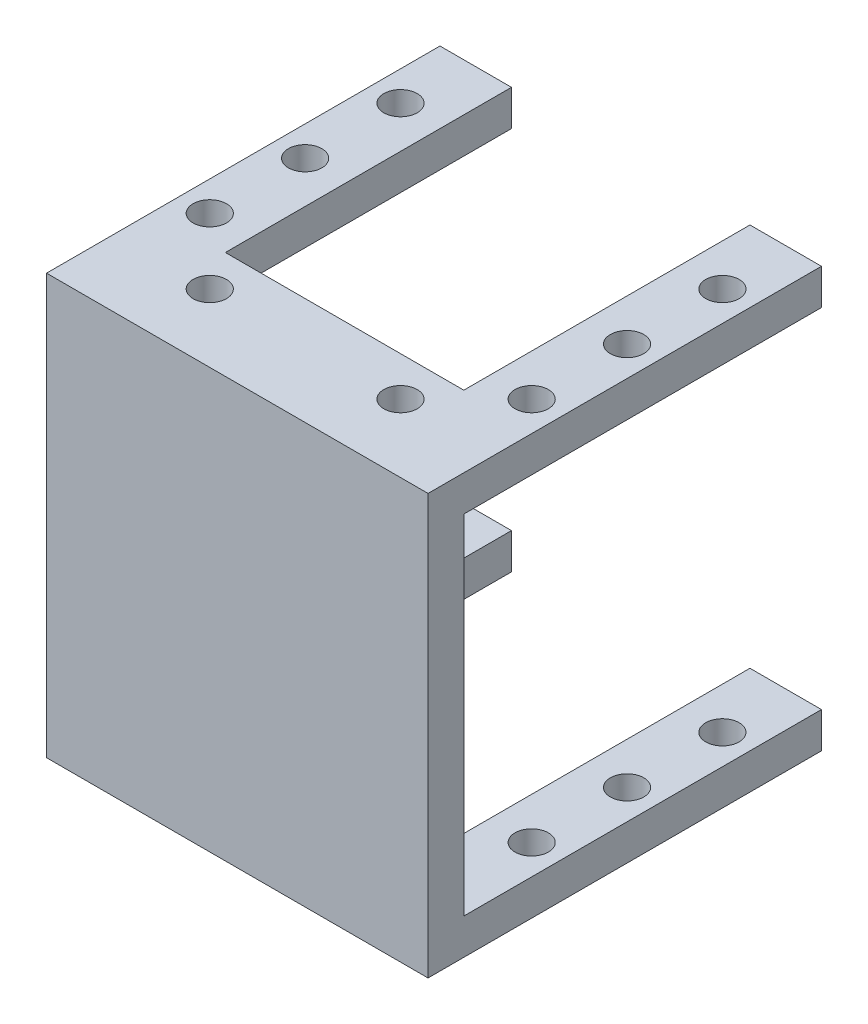
ISO-10303-21;
HEADER;
FILE_DESCRIPTION(('STEP AP214'),'2;1');
FILE_NAME('part.step','',(''),(''),'','','');
FILE_SCHEMA(('AUTOMOTIVE_DESIGN { 1 0 10303 214 1 1 1 1 }'));
ENDSEC;
DATA;
#1=APPLICATION_CONTEXT('core data for automotive mechanical design processes');
#2=APPLICATION_PROTOCOL_DEFINITION('international standard','automotive_design',2000,#1);
#3=PRODUCT_CONTEXT('',#1,'mechanical');
#4=PRODUCT('Part','Part','',(#3));
#5=PRODUCT_RELATED_PRODUCT_CATEGORY('part','',(#4));
#6=PRODUCT_DEFINITION_FORMATION('','',#4);
#7=PRODUCT_DEFINITION_CONTEXT('part definition',#1,'design');
#8=PRODUCT_DEFINITION('design','',#6,#7);
#9=PRODUCT_DEFINITION_SHAPE('','',#8);
#10=(LENGTH_UNIT() NAMED_UNIT(*) SI_UNIT(.MILLI.,.METRE.));
#11=(NAMED_UNIT(*) PLANE_ANGLE_UNIT() SI_UNIT($,.RADIAN.));
#12=(NAMED_UNIT(*) SI_UNIT($,.STERADIAN.) SOLID_ANGLE_UNIT());
#13=UNCERTAINTY_MEASURE_WITH_UNIT(LENGTH_MEASURE(1.E-05),#10,'distance_accuracy_value','');
#14=(GEOMETRIC_REPRESENTATION_CONTEXT(3) GLOBAL_UNCERTAINTY_ASSIGNED_CONTEXT((#13)) GLOBAL_UNIT_ASSIGNED_CONTEXT((#10,
#11,#12)) REPRESENTATION_CONTEXT('',''));
#15=CARTESIAN_POINT('',(0.,0.,0.));
#16=DIRECTION('',(0.,0.,1.));
#17=DIRECTION('',(1.,0.,0.));
#18=AXIS2_PLACEMENT_3D('',#15,#16,#17);
#19=CARTESIAN_POINT('',(0.,0.,6.));
#20=DIRECTION('',(0.,0.,1.));
#21=DIRECTION('',(1.,0.,0.));
#22=AXIS2_PLACEMENT_3D('',#19,#20,#21);
#23=PLANE('',#22);
#24=DIRECTION('',(1.,0.,0.));
#25=VECTOR('',#24,1.);
#26=CARTESIAN_POINT('',(-16.,32.2,6.));
#27=LINE('',#26,#25);
#28=CARTESIAN_POINT('',(-16.,32.2,6.));
#29=VERTEX_POINT('',#28);
#30=CARTESIAN_POINT('',(16.,32.2,5.99999999999999));
#31=VERTEX_POINT('',#30);
#32=EDGE_CURVE('E48',#29,#31,#27,.T.);
#33=ORIENTED_EDGE('',*,*,#32,.T.);
#34=DIRECTION('',(0.,1.,0.));
#35=VECTOR('',#34,1.);
#36=CARTESIAN_POINT('',(16.,35.2,6.));
#37=LINE('',#36,#35);
#38=CARTESIAN_POINT('',(16.,3.,5.99999999999999));
#39=VERTEX_POINT('',#38);
#40=EDGE_CURVE('E186',#39,#31,#37,.T.);
#41=ORIENTED_EDGE('',*,*,#40,.F.);
#42=DIRECTION('',(1.,0.,0.));
#43=VECTOR('',#42,1.);
#44=CARTESIAN_POINT('',(-16.,3.,6.));
#45=LINE('',#44,#43);
#46=CARTESIAN_POINT('',(-16.,3.,6.));
#47=VERTEX_POINT('',#46);
#48=EDGE_CURVE('E172',#47,#39,#45,.T.);
#49=ORIENTED_EDGE('',*,*,#48,.F.);
#50=DIRECTION('',(0.,-1.,0.));
#51=VECTOR('',#50,1.);
#52=CARTESIAN_POINT('',(-16.,35.2,6.));
#53=LINE('',#52,#51);
#54=EDGE_CURVE('E195',#29,#47,#53,.T.);
#55=ORIENTED_EDGE('',*,*,#54,.F.);
#56=EDGE_LOOP('',(#33,#41,#49,#55));
#57=FACE_BOUND('',#56,.T.);
#58=ADVANCED_FACE('F33',(#57),#23,.F.);
#59=CARTESIAN_POINT('',(0.,3.,0.));
#60=DIRECTION('',(0.,1.,0.));
#61=DIRECTION('',(0.,0.,1.));
#62=AXIS2_PLACEMENT_3D('',#59,#60,#61);
#63=PLANE('',#62);
#64=CARTESIAN_POINT('',(13.4999999999998,3.,-10.1923076923077));
#65=DIRECTION('',(0.,1.,0.));
#66=DIRECTION('',(0.,0.,-1.));
#67=AXIS2_PLACEMENT_3D('',#64,#65,#66);
#68=CIRCLE('',#67,1.4);
#69=CARTESIAN_POINT('',(13.4999999999998,3.,-11.5923076923077));
#70=VERTEX_POINT('',#69);
#71=EDGE_CURVE('E218',#70,#70,#68,.T.);
#72=ORIENTED_EDGE('',*,*,#71,.F.);
#73=EDGE_LOOP('',(#72));
#74=FACE_BOUND('',#73,.T.);
#75=CARTESIAN_POINT('',(-13.4999999999998,3.,-2.19230769230768));
#76=DIRECTION('',(0.,1.,0.));
#77=DIRECTION('',(0.,0.,1.));
#78=AXIS2_PLACEMENT_3D('',#75,#76,#77);
#79=CIRCLE('',#78,1.4);
#80=CARTESIAN_POINT('',(-13.4999999999998,3.,-0.792307692307682));
#81=VERTEX_POINT('',#80);
#82=EDGE_CURVE('E230',#81,#81,#79,.T.);
#83=ORIENTED_EDGE('',*,*,#82,.F.);
#84=EDGE_LOOP('',(#83));
#85=FACE_BOUND('',#84,.T.);
#86=CARTESIAN_POINT('',(-13.4999999999999,3.,-18.1923076923077));
#87=DIRECTION('',(0.,1.,0.));
#88=DIRECTION('',(0.,0.,1.));
#89=AXIS2_PLACEMENT_3D('',#86,#87,#88);
#90=CIRCLE('',#89,1.4);
#91=CARTESIAN_POINT('',(-13.4999999999999,3.,-16.7923076923077));
#92=VERTEX_POINT('',#91);
#93=EDGE_CURVE('E242',#92,#92,#90,.T.);
#94=ORIENTED_EDGE('',*,*,#93,.F.);
#95=EDGE_LOOP('',(#94));
#96=FACE_BOUND('',#95,.T.);
#97=CARTESIAN_POINT('',(-8.,3.,3.30769230769232));
#98=DIRECTION('',(0.,1.,0.));
#99=DIRECTION('',(0.,0.,1.));
#100=AXIS2_PLACEMENT_3D('',#97,#98,#99);
#101=CIRCLE('',#100,1.4);
#102=CARTESIAN_POINT('',(-8.,3.,4.70769230769232));
#103=VERTEX_POINT('',#102);
#104=EDGE_CURVE('E138',#103,#103,#101,.T.);
#105=ORIENTED_EDGE('',*,*,#104,.F.);
#106=EDGE_LOOP('',(#105));
#107=FACE_BOUND('',#106,.T.);
#108=DIRECTION('',(-1.,0.,0.));
#109=VECTOR('',#108,1.);
#110=CARTESIAN_POINT('',(-10.,3.,-24.));
#111=LINE('',#110,#109);
#112=CARTESIAN_POINT('',(-10.,3.,-24.));
#113=VERTEX_POINT('',#112);
#114=CARTESIAN_POINT('',(-16.,3.,-24.));
#115=VERTEX_POINT('',#114);
#116=EDGE_CURVE('E149',#113,#115,#111,.T.);
#117=ORIENTED_EDGE('',*,*,#116,.T.);
#118=DIRECTION('',(0.,0.,1.));
#119=VECTOR('',#118,1.);
#120=CARTESIAN_POINT('',(-16.,3.,-24.));
#121=LINE('',#120,#119);
#122=EDGE_CURVE('E92',#115,#47,#121,.T.);
#123=ORIENTED_EDGE('',*,*,#122,.T.);
#124=ORIENTED_EDGE('',*,*,#48,.T.);
#125=DIRECTION('',(0.,0.,-1.));
#126=VECTOR('',#125,1.);
#127=CARTESIAN_POINT('',(16.,3.,5.99999999999999));
#128=LINE('',#127,#126);
#129=CARTESIAN_POINT('',(16.,3.,-24.));
#130=VERTEX_POINT('',#129);
#131=EDGE_CURVE('E180',#39,#130,#128,.T.);
#132=ORIENTED_EDGE('',*,*,#131,.T.);
#133=DIRECTION('',(-1.,0.,0.));
#134=VECTOR('',#133,1.);
#135=CARTESIAN_POINT('',(16.,3.,-24.));
#136=LINE('',#135,#134);
#137=CARTESIAN_POINT('',(9.99999999999999,3.,-24.));
#138=VERTEX_POINT('',#137);
#139=EDGE_CURVE('E113',#130,#138,#136,.T.);
#140=ORIENTED_EDGE('',*,*,#139,.T.);
#141=DIRECTION('',(0.,0.,1.));
#142=VECTOR('',#141,1.);
#143=CARTESIAN_POINT('',(9.99999999999999,3.,-24.));
#144=LINE('',#143,#142);
#145=CARTESIAN_POINT('',(10.,3.,0.));
#146=VERTEX_POINT('',#145);
#147=EDGE_CURVE('E105',#138,#146,#144,.T.);
#148=ORIENTED_EDGE('',*,*,#147,.T.);
#149=DIRECTION('',(-1.,0.,0.));
#150=VECTOR('',#149,1.);
#151=CARTESIAN_POINT('',(10.,3.,0.));
#152=LINE('',#151,#150);
#153=CARTESIAN_POINT('',(-10.,3.,0.));
#154=VERTEX_POINT('',#153);
#155=EDGE_CURVE('E110',#146,#154,#152,.T.);
#156=ORIENTED_EDGE('',*,*,#155,.T.);
#157=DIRECTION('',(0.,0.,-1.));
#158=VECTOR('',#157,1.);
#159=CARTESIAN_POINT('',(-10.,3.,0.));
#160=LINE('',#159,#158);
#161=EDGE_CURVE('E57',#154,#113,#160,.T.);
#162=ORIENTED_EDGE('',*,*,#161,.T.);
#163=EDGE_LOOP('',(#117,#123,#124,#132,#140,#148,#156,#162));
#164=FACE_BOUND('',#163,.T.);
#165=CARTESIAN_POINT('',(8.,3.,3.30769230769232));
#166=DIRECTION('',(0.,1.,0.));
#167=DIRECTION('',(0.,0.,-1.));
#168=AXIS2_PLACEMENT_3D('',#165,#166,#167);
#169=CIRCLE('',#168,1.4);
#170=CARTESIAN_POINT('',(8.,3.,1.90769230769232));
#171=VERTEX_POINT('',#170);
#172=EDGE_CURVE('E248',#171,#171,#169,.T.);
#173=ORIENTED_EDGE('',*,*,#172,.F.);
#174=EDGE_LOOP('',(#173));
#175=FACE_BOUND('',#174,.T.);
#176=CARTESIAN_POINT('',(-13.4999999999998,3.,-10.1923076923077));
#177=DIRECTION('',(0.,1.,0.));
#178=DIRECTION('',(0.,0.,1.));
#179=AXIS2_PLACEMENT_3D('',#176,#177,#178);
#180=CIRCLE('',#179,1.4);
#181=CARTESIAN_POINT('',(-13.4999999999998,3.,-8.79230769230768));
#182=VERTEX_POINT('',#181);
#183=EDGE_CURVE('E236',#182,#182,#180,.T.);
#184=ORIENTED_EDGE('',*,*,#183,.F.);
#185=EDGE_LOOP('',(#184));
#186=FACE_BOUND('',#185,.T.);
#187=CARTESIAN_POINT('',(13.4999999999998,3.,-2.19230769230768));
#188=DIRECTION('',(0.,1.,0.));
#189=DIRECTION('',(0.,0.,-1.));
#190=AXIS2_PLACEMENT_3D('',#187,#188,#189);
#191=CIRCLE('',#190,1.4);
#192=CARTESIAN_POINT('',(13.4999999999998,3.,-3.59230769230768));
#193=VERTEX_POINT('',#192);
#194=EDGE_CURVE('E224',#193,#193,#191,.T.);
#195=ORIENTED_EDGE('',*,*,#194,.F.);
#196=EDGE_LOOP('',(#195));
#197=FACE_BOUND('',#196,.T.);
#198=CARTESIAN_POINT('',(13.4999999999999,3.,-18.1923076923077));
#199=DIRECTION('',(0.,1.,0.));
#200=DIRECTION('',(0.,0.,-1.));
#201=AXIS2_PLACEMENT_3D('',#198,#199,#200);
#202=CIRCLE('',#201,1.4);
#203=CARTESIAN_POINT('',(13.4999999999999,3.,-19.5923076923077));
#204=VERTEX_POINT('',#203);
#205=EDGE_CURVE('E212',#204,#204,#202,.T.);
#206=ORIENTED_EDGE('',*,*,#205,.F.);
#207=EDGE_LOOP('',(#206));
#208=FACE_BOUND('',#207,.T.);
#209=ADVANCED_FACE('F107',(#74,#85,#96,#107,#164,#175,#186,#197,#208),#63,.T.);
#210=CARTESIAN_POINT('',(0.,0.,0.));
#211=DIRECTION('',(0.,1.,0.));
#212=DIRECTION('',(0.,0.,1.));
#213=AXIS2_PLACEMENT_3D('',#210,#211,#212);
#214=PLANE('',#213);
#215=DIRECTION('',(-1.,0.,0.));
#216=VECTOR('',#215,1.);
#217=CARTESIAN_POINT('',(-10.,0.,-24.));
#218=LINE('',#217,#216);
#219=CARTESIAN_POINT('',(-10.,0.,-24.));
#220=VERTEX_POINT('',#219);
#221=CARTESIAN_POINT('',(-16.,0.,-24.));
#222=VERTEX_POINT('',#221);
#223=EDGE_CURVE('E134',#220,#222,#218,.T.);
#224=ORIENTED_EDGE('',*,*,#223,.F.);
#225=DIRECTION('',(0.,0.,-1.));
#226=VECTOR('',#225,1.);
#227=CARTESIAN_POINT('',(-10.,0.,0.));
#228=LINE('',#227,#226);
#229=CARTESIAN_POINT('',(-10.,0.,0.));
#230=VERTEX_POINT('',#229);
#231=EDGE_CURVE('E84',#230,#220,#228,.T.);
#232=ORIENTED_EDGE('',*,*,#231,.F.);
#233=DIRECTION('',(-1.,0.,0.));
#234=VECTOR('',#233,1.);
#235=CARTESIAN_POINT('',(10.,0.,0.));
#236=LINE('',#235,#234);
#237=CARTESIAN_POINT('',(10.,0.,0.));
#238=VERTEX_POINT('',#237);
#239=EDGE_CURVE('E146',#238,#230,#236,.T.);
#240=ORIENTED_EDGE('',*,*,#239,.F.);
#241=DIRECTION('',(0.,0.,1.));
#242=VECTOR('',#241,1.);
#243=CARTESIAN_POINT('',(9.99999999999999,0.,-24.));
#244=LINE('',#243,#242);
#245=CARTESIAN_POINT('',(9.99999999999999,0.,-24.));
#246=VERTEX_POINT('',#245);
#247=EDGE_CURVE('E122',#246,#238,#244,.T.);
#248=ORIENTED_EDGE('',*,*,#247,.F.);
#249=DIRECTION('',(-1.,0.,0.));
#250=VECTOR('',#249,1.);
#251=CARTESIAN_POINT('',(16.,0.,-24.));
#252=LINE('',#251,#250);
#253=CARTESIAN_POINT('',(16.,0.,-24.));
#254=VERTEX_POINT('',#253);
#255=EDGE_CURVE('E143',#254,#246,#252,.T.);
#256=ORIENTED_EDGE('',*,*,#255,.F.);
#257=DIRECTION('',(0.,0.,-1.));
#258=VECTOR('',#257,1.);
#259=CARTESIAN_POINT('',(16.,0.,5.99999999999999));
#260=LINE('',#259,#258);
#261=CARTESIAN_POINT('',(16.,0.,9.));
#262=VERTEX_POINT('',#261);
#263=EDGE_CURVE('E141',#262,#254,#260,.T.);
#264=ORIENTED_EDGE('',*,*,#263,.F.);
#265=DIRECTION('',(1.,0.,0.));
#266=VECTOR('',#265,1.);
#267=CARTESIAN_POINT('',(-16.,0.,9.));
#268=LINE('',#267,#266);
#269=CARTESIAN_POINT('',(-16.,0.,9.));
#270=VERTEX_POINT('',#269);
#271=EDGE_CURVE('E198',#270,#262,#268,.T.);
#272=ORIENTED_EDGE('',*,*,#271,.F.);
#273=DIRECTION('',(0.,0.,1.));
#274=VECTOR('',#273,1.);
#275=CARTESIAN_POINT('',(-16.,0.,-24.));
#276=LINE('',#275,#274);
#277=EDGE_CURVE('E137',#222,#270,#276,.T.);
#278=ORIENTED_EDGE('',*,*,#277,.F.);
#279=EDGE_LOOP('',(#224,#232,#240,#248,#256,#264,#272,#278));
#280=FACE_BOUND('',#279,.T.);
#281=CARTESIAN_POINT('',(-8.,0.,3.30769230769232));
#282=DIRECTION('',(0.,1.,0.));
#283=DIRECTION('',(0.,0.,1.));
#284=AXIS2_PLACEMENT_3D('',#281,#282,#283);
#285=CIRCLE('',#284,1.4);
#286=CARTESIAN_POINT('',(-8.,0.,4.70769230769232));
#287=VERTEX_POINT('',#286);
#288=EDGE_CURVE('E175',#287,#287,#285,.T.);
#289=ORIENTED_EDGE('',*,*,#288,.T.);
#290=EDGE_LOOP('',(#289));
#291=FACE_BOUND('',#290,.T.);
#292=CARTESIAN_POINT('',(8.,0.,3.30769230769232));
#293=DIRECTION('',(0.,1.,0.));
#294=DIRECTION('',(0.,0.,-1.));
#295=AXIS2_PLACEMENT_3D('',#292,#293,#294);
#296=CIRCLE('',#295,1.4);
#297=CARTESIAN_POINT('',(8.,0.,1.90769230769232));
#298=VERTEX_POINT('',#297);
#299=EDGE_CURVE('E245',#298,#298,#296,.T.);
#300=ORIENTED_EDGE('',*,*,#299,.T.);
#301=EDGE_LOOP('',(#300));
#302=FACE_BOUND('',#301,.T.);
#303=CARTESIAN_POINT('',(-13.4999999999999,0.,-18.1923076923077));
#304=DIRECTION('',(0.,1.,0.));
#305=DIRECTION('',(0.,0.,1.));
#306=AXIS2_PLACEMENT_3D('',#303,#304,#305);
#307=CIRCLE('',#306,1.4);
#308=CARTESIAN_POINT('',(-13.4999999999999,0.,-16.7923076923077));
#309=VERTEX_POINT('',#308);
#310=EDGE_CURVE('E239',#309,#309,#307,.T.);
#311=ORIENTED_EDGE('',*,*,#310,.T.);
#312=EDGE_LOOP('',(#311));
#313=FACE_BOUND('',#312,.T.);
#314=CARTESIAN_POINT('',(-13.4999999999998,0.,-10.1923076923077));
#315=DIRECTION('',(0.,1.,0.));
#316=DIRECTION('',(0.,0.,1.));
#317=AXIS2_PLACEMENT_3D('',#314,#315,#316);
#318=CIRCLE('',#317,1.4);
#319=CARTESIAN_POINT('',(-13.4999999999998,0.,-8.79230769230768));
#320=VERTEX_POINT('',#319);
#321=EDGE_CURVE('E233',#320,#320,#318,.T.);
#322=ORIENTED_EDGE('',*,*,#321,.T.);
#323=EDGE_LOOP('',(#322));
#324=FACE_BOUND('',#323,.T.);
#325=CARTESIAN_POINT('',(-13.4999999999998,0.,-2.19230769230768));
#326=DIRECTION('',(0.,1.,0.));
#327=DIRECTION('',(0.,0.,1.));
#328=AXIS2_PLACEMENT_3D('',#325,#326,#327);
#329=CIRCLE('',#328,1.4);
#330=CARTESIAN_POINT('',(-13.4999999999998,0.,-0.792307692307682));
#331=VERTEX_POINT('',#330);
#332=EDGE_CURVE('E227',#331,#331,#329,.T.);
#333=ORIENTED_EDGE('',*,*,#332,.T.);
#334=EDGE_LOOP('',(#333));
#335=FACE_BOUND('',#334,.T.);
#336=CARTESIAN_POINT('',(13.4999999999998,0.,-2.19230769230768));
#337=DIRECTION('',(0.,1.,0.));
#338=DIRECTION('',(0.,0.,-1.));
#339=AXIS2_PLACEMENT_3D('',#336,#337,#338);
#340=CIRCLE('',#339,1.4);
#341=CARTESIAN_POINT('',(13.4999999999998,0.,-3.59230769230768));
#342=VERTEX_POINT('',#341);
#343=EDGE_CURVE('E221',#342,#342,#340,.T.);
#344=ORIENTED_EDGE('',*,*,#343,.T.);
#345=EDGE_LOOP('',(#344));
#346=FACE_BOUND('',#345,.T.);
#347=CARTESIAN_POINT('',(13.4999999999998,0.,-10.1923076923077));
#348=DIRECTION('',(0.,1.,0.));
#349=DIRECTION('',(0.,0.,-1.));
#350=AXIS2_PLACEMENT_3D('',#347,#348,#349);
#351=CIRCLE('',#350,1.4);
#352=CARTESIAN_POINT('',(13.4999999999998,0.,-11.5923076923077));
#353=VERTEX_POINT('',#352);
#354=EDGE_CURVE('E215',#353,#353,#351,.T.);
#355=ORIENTED_EDGE('',*,*,#354,.T.);
#356=EDGE_LOOP('',(#355));
#357=FACE_BOUND('',#356,.T.);
#358=CARTESIAN_POINT('',(13.4999999999999,0.,-18.1923076923077));
#359=DIRECTION('',(0.,1.,0.));
#360=DIRECTION('',(0.,0.,-1.));
#361=AXIS2_PLACEMENT_3D('',#358,#359,#360);
#362=CIRCLE('',#361,1.4);
#363=CARTESIAN_POINT('',(13.4999999999999,0.,-19.5923076923077));
#364=VERTEX_POINT('',#363);
#365=EDGE_CURVE('E211',#364,#364,#362,.T.);
#366=ORIENTED_EDGE('',*,*,#365,.T.);
#367=EDGE_LOOP('',(#366));
#368=FACE_BOUND('',#367,.T.);
#369=ADVANCED_FACE('F162',(#280,#291,#302,#313,#324,#335,#346,#357,#368),#214,.F.);
#370=CARTESIAN_POINT('',(-10.,3.,-24.));
#371=DIRECTION('',(0.,0.,1.));
#372=DIRECTION('',(1.,0.,0.));
#373=AXIS2_PLACEMENT_3D('',#370,#371,#372);
#374=PLANE('',#373);
#375=ORIENTED_EDGE('',*,*,#223,.T.);
#376=DIRECTION('',(0.,-1.,0.));
#377=VECTOR('',#376,1.);
#378=CARTESIAN_POINT('',(-16.,3.,-24.));
#379=LINE('',#378,#377);
#380=EDGE_CURVE('E11',#115,#222,#379,.T.);
#381=ORIENTED_EDGE('',*,*,#380,.F.);
#382=ORIENTED_EDGE('',*,*,#116,.F.);
#383=DIRECTION('',(0.,-1.,0.));
#384=VECTOR('',#383,1.);
#385=CARTESIAN_POINT('',(-10.,3.,-24.));
#386=LINE('',#385,#384);
#387=EDGE_CURVE('E130',#113,#220,#386,.T.);
#388=ORIENTED_EDGE('',*,*,#387,.T.);
#389=EDGE_LOOP('',(#375,#381,#382,#388));
#390=FACE_BOUND('',#389,.T.);
#391=ADVANCED_FACE('F35',(#390),#374,.F.);
#392=CARTESIAN_POINT('',(-16.,3.,-24.));
#393=DIRECTION('',(1.,0.,0.));
#394=DIRECTION('',(0.,0.,-1.));
#395=AXIS2_PLACEMENT_3D('',#392,#393,#394);
#396=PLANE('',#395);
#397=ORIENTED_EDGE('',*,*,#277,.T.);
#398=DIRECTION('',(0.,-1.,0.));
#399=VECTOR('',#398,1.);
#400=CARTESIAN_POINT('',(-16.,35.2,9.));
#401=LINE('',#400,#399);
#402=CARTESIAN_POINT('',(-16.,35.2,9.));
#403=VERTEX_POINT('',#402);
#404=EDGE_CURVE('E194',#403,#270,#401,.T.);
#405=ORIENTED_EDGE('',*,*,#404,.F.);
#406=DIRECTION('',(0.,0.,-1.));
#407=VECTOR('',#406,1.);
#408=CARTESIAN_POINT('',(-16.,35.2,9.));
#409=LINE('',#408,#407);
#410=CARTESIAN_POINT('',(-16.,35.2,-24.));
#411=VERTEX_POINT('',#410);
#412=EDGE_CURVE('E204',#403,#411,#409,.T.);
#413=ORIENTED_EDGE('',*,*,#412,.T.);
#414=DIRECTION('',(0.,-1.,0.));
#415=VECTOR('',#414,1.);
#416=CARTESIAN_POINT('',(-16.,35.2,-24.));
#417=LINE('',#416,#415);
#418=CARTESIAN_POINT('',(-16.,32.2,-24.));
#419=VERTEX_POINT('',#418);
#420=EDGE_CURVE('E368',#411,#419,#417,.T.);
#421=ORIENTED_EDGE('',*,*,#420,.T.);
#422=DIRECTION('',(0.,0.,1.));
#423=VECTOR('',#422,1.);
#424=CARTESIAN_POINT('',(-16.,32.2,-24.));
#425=LINE('',#424,#423);
#426=EDGE_CURVE('E400',#419,#29,#425,.T.);
#427=ORIENTED_EDGE('',*,*,#426,.T.);
#428=ORIENTED_EDGE('',*,*,#54,.T.);
#429=ORIENTED_EDGE('',*,*,#122,.F.);
#430=ORIENTED_EDGE('',*,*,#380,.T.);
#431=EDGE_LOOP('',(#397,#405,#413,#421,#427,#428,#429,#430));
#432=FACE_BOUND('',#431,.T.);
#433=ADVANCED_FACE('F334',(#432),#396,.F.);
#434=CARTESIAN_POINT('',(16.,3.,5.99999999999999));
#435=DIRECTION('',(-1.,0.,0.));
#436=DIRECTION('',(0.,0.,1.));
#437=AXIS2_PLACEMENT_3D('',#434,#435,#436);
#438=PLANE('',#437);
#439=ORIENTED_EDGE('',*,*,#263,.T.);
#440=DIRECTION('',(0.,-1.,0.));
#441=VECTOR('',#440,1.);
#442=CARTESIAN_POINT('',(16.,3.,-24.));
#443=LINE('',#442,#441);
#444=EDGE_CURVE('E41',#130,#254,#443,.T.);
#445=ORIENTED_EDGE('',*,*,#444,.F.);
#446=ORIENTED_EDGE('',*,*,#131,.F.);
#447=ORIENTED_EDGE('',*,*,#40,.T.);
#448=DIRECTION('',(0.,0.,-1.));
#449=VECTOR('',#448,1.);
#450=CARTESIAN_POINT('',(16.,32.2,5.99999999999999));
#451=LINE('',#450,#449);
#452=CARTESIAN_POINT('',(16.,32.2,-24.));
#453=VERTEX_POINT('',#452);
#454=EDGE_CURVE('E189',#31,#453,#451,.T.);
#455=ORIENTED_EDGE('',*,*,#454,.T.);
#456=DIRECTION('',(0.,-1.,0.));
#457=VECTOR('',#456,1.);
#458=CARTESIAN_POINT('',(16.,35.2,-24.));
#459=LINE('',#458,#457);
#460=CARTESIAN_POINT('',(16.,35.2,-24.));
#461=VERTEX_POINT('',#460);
#462=EDGE_CURVE('E200',#461,#453,#459,.T.);
#463=ORIENTED_EDGE('',*,*,#462,.F.);
#464=DIRECTION('',(0.,0.,-1.));
#465=VECTOR('',#464,1.);
#466=CARTESIAN_POINT('',(16.,35.2,9.));
#467=LINE('',#466,#465);
#468=CARTESIAN_POINT('',(16.,35.2,9.));
#469=VERTEX_POINT('',#468);
#470=EDGE_CURVE('E207',#469,#461,#467,.T.);
#471=ORIENTED_EDGE('',*,*,#470,.F.);
#472=DIRECTION('',(0.,1.,0.));
#473=VECTOR('',#472,1.);
#474=CARTESIAN_POINT('',(16.,35.2,9.));
#475=LINE('',#474,#473);
#476=EDGE_CURVE('E354',#262,#469,#475,.T.);
#477=ORIENTED_EDGE('',*,*,#476,.F.);
#478=EDGE_LOOP('',(#439,#445,#446,#447,#455,#463,#471,#477));
#479=FACE_BOUND('',#478,.T.);
#480=ADVANCED_FACE('F183',(#479),#438,.F.);
#481=CARTESIAN_POINT('',(16.,3.,-24.));
#482=DIRECTION('',(0.,0.,1.));
#483=DIRECTION('',(1.,0.,0.));
#484=AXIS2_PLACEMENT_3D('',#481,#482,#483);
#485=PLANE('',#484);
#486=ORIENTED_EDGE('',*,*,#255,.T.);
#487=DIRECTION('',(0.,-1.,0.));
#488=VECTOR('',#487,1.);
#489=CARTESIAN_POINT('',(9.99999999999999,3.,-24.));
#490=LINE('',#489,#488);
#491=EDGE_CURVE('E125',#138,#246,#490,.T.);
#492=ORIENTED_EDGE('',*,*,#491,.F.);
#493=ORIENTED_EDGE('',*,*,#139,.F.);
#494=ORIENTED_EDGE('',*,*,#444,.T.);
#495=EDGE_LOOP('',(#486,#492,#493,#494));
#496=FACE_BOUND('',#495,.T.);
#497=ADVANCED_FACE('F156',(#496),#485,.F.);
#498=CARTESIAN_POINT('',(9.99999999999999,3.,-24.));
#499=DIRECTION('',(1.,0.,0.));
#500=DIRECTION('',(0.,0.,-1.));
#501=AXIS2_PLACEMENT_3D('',#498,#499,#500);
#502=PLANE('',#501);
#503=ORIENTED_EDGE('',*,*,#247,.T.);
#504=DIRECTION('',(0.,-1.,0.));
#505=VECTOR('',#504,1.);
#506=CARTESIAN_POINT('',(10.,3.,0.));
#507=LINE('',#506,#505);
#508=EDGE_CURVE('E119',#146,#238,#507,.T.);
#509=ORIENTED_EDGE('',*,*,#508,.F.);
#510=ORIENTED_EDGE('',*,*,#147,.F.);
#511=ORIENTED_EDGE('',*,*,#491,.T.);
#512=EDGE_LOOP('',(#503,#509,#510,#511));
#513=FACE_BOUND('',#512,.T.);
#514=ADVANCED_FACE('F120',(#513),#502,.F.);
#515=CARTESIAN_POINT('',(10.,3.,0.));
#516=DIRECTION('',(0.,0.,1.));
#517=DIRECTION('',(1.,0.,0.));
#518=AXIS2_PLACEMENT_3D('',#515,#516,#517);
#519=PLANE('',#518);
#520=ORIENTED_EDGE('',*,*,#239,.T.);
#521=DIRECTION('',(0.,-1.,0.));
#522=VECTOR('',#521,1.);
#523=CARTESIAN_POINT('',(-10.,3.,0.));
#524=LINE('',#523,#522);
#525=EDGE_CURVE('E126',#154,#230,#524,.T.);
#526=ORIENTED_EDGE('',*,*,#525,.F.);
#527=ORIENTED_EDGE('',*,*,#155,.F.);
#528=ORIENTED_EDGE('',*,*,#508,.T.);
#529=EDGE_LOOP('',(#520,#526,#527,#528));
#530=FACE_BOUND('',#529,.T.);
#531=ADVANCED_FACE('F128',(#530),#519,.F.);
#532=CARTESIAN_POINT('',(-10.,3.,0.));
#533=DIRECTION('',(-1.,0.,0.));
#534=DIRECTION('',(0.,0.,1.));
#535=AXIS2_PLACEMENT_3D('',#532,#533,#534);
#536=PLANE('',#535);
#537=ORIENTED_EDGE('',*,*,#231,.T.);
#538=ORIENTED_EDGE('',*,*,#387,.F.);
#539=ORIENTED_EDGE('',*,*,#161,.F.);
#540=ORIENTED_EDGE('',*,*,#525,.T.);
#541=EDGE_LOOP('',(#537,#538,#539,#540));
#542=FACE_BOUND('',#541,.T.);
#543=ADVANCED_FACE('F167',(#542),#536,.F.);
#544=CARTESIAN_POINT('',(-8.,3.,3.30769230769232));
#545=DIRECTION('',(0.,-1.,0.));
#546=DIRECTION('',(0.,0.,-1.));
#547=AXIS2_PLACEMENT_3D('',#544,#545,#546);
#548=CYLINDRICAL_SURFACE('',#547,1.4);
#549=ORIENTED_EDGE('',*,*,#104,.T.);
#550=EDGE_LOOP('',(#549));
#551=FACE_BOUND('',#550,.T.);
#552=ORIENTED_EDGE('',*,*,#288,.F.);
#553=EDGE_LOOP('',(#552));
#554=FACE_BOUND('',#553,.T.);
#555=ADVANCED_FACE('F259',(#551,#554),#548,.F.);
#556=CARTESIAN_POINT('',(8.,3.,3.30769230769232));
#557=DIRECTION('',(0.,-1.,0.));
#558=DIRECTION('',(0.,0.,-1.));
#559=AXIS2_PLACEMENT_3D('',#556,#557,#558);
#560=CYLINDRICAL_SURFACE('',#559,1.4);
#561=ORIENTED_EDGE('',*,*,#172,.T.);
#562=EDGE_LOOP('',(#561));
#563=FACE_BOUND('',#562,.T.);
#564=ORIENTED_EDGE('',*,*,#299,.F.);
#565=EDGE_LOOP('',(#564));
#566=FACE_BOUND('',#565,.T.);
#567=ADVANCED_FACE('F261',(#563,#566),#560,.F.);
#568=CARTESIAN_POINT('',(-13.4999999999999,3.,-18.1923076923077));
#569=DIRECTION('',(0.,-1.,0.));
#570=DIRECTION('',(0.,0.,-1.));
#571=AXIS2_PLACEMENT_3D('',#568,#569,#570);
#572=CYLINDRICAL_SURFACE('',#571,1.4);
#573=ORIENTED_EDGE('',*,*,#93,.T.);
#574=EDGE_LOOP('',(#573));
#575=FACE_BOUND('',#574,.T.);
#576=ORIENTED_EDGE('',*,*,#310,.F.);
#577=EDGE_LOOP('',(#576));
#578=FACE_BOUND('',#577,.T.);
#579=ADVANCED_FACE('F267',(#575,#578),#572,.F.);
#580=CARTESIAN_POINT('',(-13.4999999999998,3.,-10.1923076923077));
#581=DIRECTION('',(0.,-1.,0.));
#582=DIRECTION('',(0.,0.,-1.));
#583=AXIS2_PLACEMENT_3D('',#580,#581,#582);
#584=CYLINDRICAL_SURFACE('',#583,1.4);
#585=ORIENTED_EDGE('',*,*,#183,.T.);
#586=EDGE_LOOP('',(#585));
#587=FACE_BOUND('',#586,.T.);
#588=ORIENTED_EDGE('',*,*,#321,.F.);
#589=EDGE_LOOP('',(#588));
#590=FACE_BOUND('',#589,.T.);
#591=ADVANCED_FACE('F301',(#587,#590),#584,.F.);
#592=CARTESIAN_POINT('',(-13.4999999999998,3.,-2.19230769230768));
#593=DIRECTION('',(0.,-1.,0.));
#594=DIRECTION('',(0.,0.,-1.));
#595=AXIS2_PLACEMENT_3D('',#592,#593,#594);
#596=CYLINDRICAL_SURFACE('',#595,1.4);
#597=ORIENTED_EDGE('',*,*,#82,.T.);
#598=EDGE_LOOP('',(#597));
#599=FACE_BOUND('',#598,.T.);
#600=ORIENTED_EDGE('',*,*,#332,.F.);
#601=EDGE_LOOP('',(#600));
#602=FACE_BOUND('',#601,.T.);
#603=ADVANCED_FACE('F297',(#599,#602),#596,.F.);
#604=CARTESIAN_POINT('',(13.4999999999998,3.,-2.19230769230768));
#605=DIRECTION('',(0.,-1.,0.));
#606=DIRECTION('',(0.,0.,-1.));
#607=AXIS2_PLACEMENT_3D('',#604,#605,#606);
#608=CYLINDRICAL_SURFACE('',#607,1.4);
#609=ORIENTED_EDGE('',*,*,#194,.T.);
#610=EDGE_LOOP('',(#609));
#611=FACE_BOUND('',#610,.T.);
#612=ORIENTED_EDGE('',*,*,#343,.F.);
#613=EDGE_LOOP('',(#612));
#614=FACE_BOUND('',#613,.T.);
#615=ADVANCED_FACE('F293',(#611,#614),#608,.F.);
#616=CARTESIAN_POINT('',(13.4999999999998,3.,-10.1923076923077));
#617=DIRECTION('',(0.,-1.,0.));
#618=DIRECTION('',(0.,0.,-1.));
#619=AXIS2_PLACEMENT_3D('',#616,#617,#618);
#620=CYLINDRICAL_SURFACE('',#619,1.4);
#621=ORIENTED_EDGE('',*,*,#71,.T.);
#622=EDGE_LOOP('',(#621));
#623=FACE_BOUND('',#622,.T.);
#624=ORIENTED_EDGE('',*,*,#354,.F.);
#625=EDGE_LOOP('',(#624));
#626=FACE_BOUND('',#625,.T.);
#627=ADVANCED_FACE('F289',(#623,#626),#620,.F.);
#628=CARTESIAN_POINT('',(13.4999999999999,3.,-18.1923076923077));
#629=DIRECTION('',(0.,-1.,0.));
#630=DIRECTION('',(0.,0.,-1.));
#631=AXIS2_PLACEMENT_3D('',#628,#629,#630);
#632=CYLINDRICAL_SURFACE('',#631,1.4);
#633=ORIENTED_EDGE('',*,*,#205,.T.);
#634=EDGE_LOOP('',(#633));
#635=FACE_BOUND('',#634,.T.);
#636=ORIENTED_EDGE('',*,*,#365,.F.);
#637=EDGE_LOOP('',(#636));
#638=FACE_BOUND('',#637,.T.);
#639=ADVANCED_FACE('F285',(#635,#638),#632,.F.);
#640=CARTESIAN_POINT('',(-16.,35.2,9.));
#641=DIRECTION('',(0.,-1.,0.));
#642=DIRECTION('',(0.,0.,-1.));
#643=AXIS2_PLACEMENT_3D('',#640,#641,#642);
#644=PLANE('',#643);
#645=ORIENTED_EDGE('',*,*,#470,.T.);
#646=DIRECTION('',(-1.,0.,0.));
#647=VECTOR('',#646,1.);
#648=CARTESIAN_POINT('',(16.,35.2,-24.));
#649=LINE('',#648,#647);
#650=CARTESIAN_POINT('',(9.99999999999999,35.2,-24.));
#651=VERTEX_POINT('',#650);
#652=EDGE_CURVE('E409',#461,#651,#649,.T.);
#653=ORIENTED_EDGE('',*,*,#652,.T.);
#654=DIRECTION('',(0.,0.,1.));
#655=VECTOR('',#654,1.);
#656=CARTESIAN_POINT('',(9.99999999999999,35.2,-24.));
#657=LINE('',#656,#655);
#658=CARTESIAN_POINT('',(10.,35.2,0.));
#659=VERTEX_POINT('',#658);
#660=EDGE_CURVE('E442',#651,#659,#657,.T.);
#661=ORIENTED_EDGE('',*,*,#660,.T.);
#662=DIRECTION('',(-1.,0.,0.));
#663=VECTOR('',#662,1.);
#664=CARTESIAN_POINT('',(10.,35.2,0.));
#665=LINE('',#664,#663);
#666=CARTESIAN_POINT('',(-10.,35.2,0.));
#667=VERTEX_POINT('',#666);
#668=EDGE_CURVE('E437',#659,#667,#665,.T.);
#669=ORIENTED_EDGE('',*,*,#668,.T.);
#670=DIRECTION('',(0.,0.,-1.));
#671=VECTOR('',#670,1.);
#672=CARTESIAN_POINT('',(-10.,35.2,0.));
#673=LINE('',#672,#671);
#674=CARTESIAN_POINT('',(-10.,35.2,-24.));
#675=VERTEX_POINT('',#674);
#676=EDGE_CURVE('E440',#667,#675,#673,.T.);
#677=ORIENTED_EDGE('',*,*,#676,.T.);
#678=DIRECTION('',(-1.,0.,0.));
#679=VECTOR('',#678,1.);
#680=CARTESIAN_POINT('',(-10.,35.2,-24.));
#681=LINE('',#680,#679);
#682=EDGE_CURVE('E365',#675,#411,#681,.T.);
#683=ORIENTED_EDGE('',*,*,#682,.T.);
#684=ORIENTED_EDGE('',*,*,#412,.F.);
#685=DIRECTION('',(-1.,0.,0.));
#686=VECTOR('',#685,1.);
#687=CARTESIAN_POINT('',(-16.,35.2,9.));
#688=LINE('',#687,#686);
#689=EDGE_CURVE('E208',#469,#403,#688,.T.);
#690=ORIENTED_EDGE('',*,*,#689,.F.);
#691=EDGE_LOOP('',(#645,#653,#661,#669,#677,#683,#684,#690));
#692=FACE_BOUND('',#691,.T.);
#693=CARTESIAN_POINT('',(-13.4999999999998,35.2,-10.1923076923077));
#694=DIRECTION('',(0.,1.,0.));
#695=DIRECTION('',(0.,0.,1.));
#696=AXIS2_PLACEMENT_3D('',#693,#694,#695);
#697=CIRCLE('',#696,1.4);
#698=CARTESIAN_POINT('',(-13.4999999999998,35.2,-8.79230769230768));
#699=VERTEX_POINT('',#698);
#700=EDGE_CURVE('E502',#699,#699,#697,.T.);
#701=ORIENTED_EDGE('',*,*,#700,.F.);
#702=EDGE_LOOP('',(#701));
#703=FACE_BOUND('',#702,.T.);
#704=CARTESIAN_POINT('',(8.,35.2,3.30769230769232));
#705=DIRECTION('',(0.,1.,0.));
#706=DIRECTION('',(0.,0.,1.));
#707=AXIS2_PLACEMENT_3D('',#704,#705,#706);
#708=CIRCLE('',#707,1.4);
#709=CARTESIAN_POINT('',(8.,35.2,4.70769230769231));
#710=VERTEX_POINT('',#709);
#711=EDGE_CURVE('E510',#710,#710,#708,.T.);
#712=ORIENTED_EDGE('',*,*,#711,.F.);
#713=EDGE_LOOP('',(#712));
#714=FACE_BOUND('',#713,.T.);
#715=CARTESIAN_POINT('',(13.4999999999998,35.2,-10.1923076923077));
#716=DIRECTION('',(0.,1.,0.));
#717=DIRECTION('',(0.,0.,1.));
#718=AXIS2_PLACEMENT_3D('',#715,#716,#717);
#719=CIRCLE('',#718,1.4);
#720=CARTESIAN_POINT('',(13.4999999999998,35.2,-8.79230769230768));
#721=VERTEX_POINT('',#720);
#722=EDGE_CURVE('E518',#721,#721,#719,.T.);
#723=ORIENTED_EDGE('',*,*,#722,.F.);
#724=EDGE_LOOP('',(#723));
#725=FACE_BOUND('',#724,.T.);
#726=CARTESIAN_POINT('',(-13.4999999999999,35.2,-18.1923076923077));
#727=DIRECTION('',(0.,1.,0.));
#728=DIRECTION('',(0.,0.,1.));
#729=AXIS2_PLACEMENT_3D('',#726,#727,#728);
#730=CIRCLE('',#729,1.4);
#731=CARTESIAN_POINT('',(-13.4999999999999,35.2,-16.7923076923077));
#732=VERTEX_POINT('',#731);
#733=EDGE_CURVE('E455',#732,#732,#730,.T.);
#734=ORIENTED_EDGE('',*,*,#733,.F.);
#735=EDGE_LOOP('',(#734));
#736=FACE_BOUND('',#735,.T.);
#737=CARTESIAN_POINT('',(13.4999999999999,35.2,-18.1923076923077));
#738=DIRECTION('',(0.,1.,0.));
#739=DIRECTION('',(0.,0.,1.));
#740=AXIS2_PLACEMENT_3D('',#737,#738,#739);
#741=CIRCLE('',#740,1.4);
#742=CARTESIAN_POINT('',(13.4999999999999,35.2,-16.7923076923077));
#743=VERTEX_POINT('',#742);
#744=EDGE_CURVE('E522',#743,#743,#741,.T.);
#745=ORIENTED_EDGE('',*,*,#744,.F.);
#746=EDGE_LOOP('',(#745));
#747=FACE_BOUND('',#746,.T.);
#748=CARTESIAN_POINT('',(13.4999999999998,35.2,-2.19230769230768));
#749=DIRECTION('',(0.,1.,0.));
#750=DIRECTION('',(0.,0.,1.));
#751=AXIS2_PLACEMENT_3D('',#748,#749,#750);
#752=CIRCLE('',#751,1.4);
#753=CARTESIAN_POINT('',(13.4999999999998,35.2,-0.792307692307685));
#754=VERTEX_POINT('',#753);
#755=EDGE_CURVE('E514',#754,#754,#752,.T.);
#756=ORIENTED_EDGE('',*,*,#755,.F.);
#757=EDGE_LOOP('',(#756));
#758=FACE_BOUND('',#757,.T.);
#759=CARTESIAN_POINT('',(-8.,35.2,3.30769230769232));
#760=DIRECTION('',(0.,1.,0.));
#761=DIRECTION('',(0.,0.,1.));
#762=AXIS2_PLACEMENT_3D('',#759,#760,#761);
#763=CIRCLE('',#762,1.4);
#764=CARTESIAN_POINT('',(-8.,35.2,4.70769230769232));
#765=VERTEX_POINT('',#764);
#766=EDGE_CURVE('E506',#765,#765,#763,.T.);
#767=ORIENTED_EDGE('',*,*,#766,.F.);
#768=EDGE_LOOP('',(#767));
#769=FACE_BOUND('',#768,.T.);
#770=CARTESIAN_POINT('',(-13.4999999999998,35.2,-2.19230769230768));
#771=DIRECTION('',(0.,1.,0.));
#772=DIRECTION('',(0.,0.,1.));
#773=AXIS2_PLACEMENT_3D('',#770,#771,#772);
#774=CIRCLE('',#773,1.4);
#775=CARTESIAN_POINT('',(-13.4999999999998,35.2,-0.792307692307682));
#776=VERTEX_POINT('',#775);
#777=EDGE_CURVE('E497',#776,#776,#774,.T.);
#778=ORIENTED_EDGE('',*,*,#777,.F.);
#779=EDGE_LOOP('',(#778));
#780=FACE_BOUND('',#779,.T.);
#781=ADVANCED_FACE('F282',(#692,#703,#714,#725,#736,#747,#758,#769,#780),#644,.F.);
#782=CARTESIAN_POINT('',(0.,0.,9.));
#783=DIRECTION('',(0.,0.,1.));
#784=DIRECTION('',(1.,0.,0.));
#785=AXIS2_PLACEMENT_3D('',#782,#783,#784);
#786=PLANE('',#785);
#787=ORIENTED_EDGE('',*,*,#404,.T.);
#788=ORIENTED_EDGE('',*,*,#271,.T.);
#789=ORIENTED_EDGE('',*,*,#476,.T.);
#790=ORIENTED_EDGE('',*,*,#689,.T.);
#791=EDGE_LOOP('',(#787,#788,#789,#790));
#792=FACE_BOUND('',#791,.T.);
#793=ADVANCED_FACE('F280',(#792),#786,.T.);
#794=CARTESIAN_POINT('',(0.,32.2,0.));
#795=DIRECTION('',(0.,1.,0.));
#796=DIRECTION('',(0.,0.,1.));
#797=AXIS2_PLACEMENT_3D('',#794,#795,#796);
#798=PLANE('',#797);
#799=ORIENTED_EDGE('',*,*,#454,.F.);
#800=ORIENTED_EDGE('',*,*,#32,.F.);
#801=ORIENTED_EDGE('',*,*,#426,.F.);
#802=DIRECTION('',(-1.,0.,0.));
#803=VECTOR('',#802,1.);
#804=CARTESIAN_POINT('',(-10.,32.2,-24.));
#805=LINE('',#804,#803);
#806=CARTESIAN_POINT('',(-10.,32.2,-24.));
#807=VERTEX_POINT('',#806);
#808=EDGE_CURVE('E395',#807,#419,#805,.T.);
#809=ORIENTED_EDGE('',*,*,#808,.F.);
#810=DIRECTION('',(0.,0.,-1.));
#811=VECTOR('',#810,1.);
#812=CARTESIAN_POINT('',(-10.,32.2,0.));
#813=LINE('',#812,#811);
#814=CARTESIAN_POINT('',(-10.,32.2,0.));
#815=VERTEX_POINT('',#814);
#816=EDGE_CURVE('E401',#815,#807,#813,.T.);
#817=ORIENTED_EDGE('',*,*,#816,.F.);
#818=DIRECTION('',(-1.,0.,0.));
#819=VECTOR('',#818,1.);
#820=CARTESIAN_POINT('',(10.,32.2,0.));
#821=LINE('',#820,#819);
#822=CARTESIAN_POINT('',(10.,32.2,0.));
#823=VERTEX_POINT('',#822);
#824=EDGE_CURVE('E404',#823,#815,#821,.T.);
#825=ORIENTED_EDGE('',*,*,#824,.F.);
#826=DIRECTION('',(0.,0.,1.));
#827=VECTOR('',#826,1.);
#828=CARTESIAN_POINT('',(9.99999999999999,32.2,-24.));
#829=LINE('',#828,#827);
#830=CARTESIAN_POINT('',(9.99999999999999,32.2,-24.));
#831=VERTEX_POINT('',#830);
#832=EDGE_CURVE('E457',#831,#823,#829,.T.);
#833=ORIENTED_EDGE('',*,*,#832,.F.);
#834=DIRECTION('',(-1.,0.,0.));
#835=VECTOR('',#834,1.);
#836=CARTESIAN_POINT('',(16.,32.2,-24.));
#837=LINE('',#836,#835);
#838=EDGE_CURVE('E427',#453,#831,#837,.T.);
#839=ORIENTED_EDGE('',*,*,#838,.F.);
#840=EDGE_LOOP('',(#799,#800,#801,#809,#817,#825,#833,#839));
#841=FACE_BOUND('',#840,.T.);
#842=CARTESIAN_POINT('',(-13.4999999999999,32.2,-18.1923076923077));
#843=DIRECTION('',(0.,1.,0.));
#844=DIRECTION('',(0.,0.,1.));
#845=AXIS2_PLACEMENT_3D('',#842,#843,#844);
#846=CIRCLE('',#845,1.4);
#847=CARTESIAN_POINT('',(-13.4999999999999,32.2,-16.7923076923077));
#848=VERTEX_POINT('',#847);
#849=EDGE_CURVE('E468',#848,#848,#846,.T.);
#850=ORIENTED_EDGE('',*,*,#849,.T.);
#851=EDGE_LOOP('',(#850));
#852=FACE_BOUND('',#851,.T.);
#853=CARTESIAN_POINT('',(13.4999999999999,32.2,-18.1923076923077));
#854=DIRECTION('',(0.,1.,0.));
#855=DIRECTION('',(0.,0.,1.));
#856=AXIS2_PLACEMENT_3D('',#853,#854,#855);
#857=CIRCLE('',#856,1.4);
#858=CARTESIAN_POINT('',(13.4999999999999,32.2,-16.7923076923077));
#859=VERTEX_POINT('',#858);
#860=EDGE_CURVE('E472',#859,#859,#857,.T.);
#861=ORIENTED_EDGE('',*,*,#860,.T.);
#862=EDGE_LOOP('',(#861));
#863=FACE_BOUND('',#862,.T.);
#864=CARTESIAN_POINT('',(13.4999999999998,32.2,-10.1923076923077));
#865=DIRECTION('',(0.,1.,0.));
#866=DIRECTION('',(0.,0.,1.));
#867=AXIS2_PLACEMENT_3D('',#864,#865,#866);
#868=CIRCLE('',#867,1.4);
#869=CARTESIAN_POINT('',(13.4999999999998,32.2,-8.79230769230768));
#870=VERTEX_POINT('',#869);
#871=EDGE_CURVE('E476',#870,#870,#868,.T.);
#872=ORIENTED_EDGE('',*,*,#871,.T.);
#873=EDGE_LOOP('',(#872));
#874=FACE_BOUND('',#873,.T.);
#875=CARTESIAN_POINT('',(13.4999999999998,32.2,-2.19230769230768));
#876=DIRECTION('',(0.,1.,0.));
#877=DIRECTION('',(0.,0.,1.));
#878=AXIS2_PLACEMENT_3D('',#875,#876,#877);
#879=CIRCLE('',#878,1.4);
#880=CARTESIAN_POINT('',(13.4999999999998,32.2,-0.792307692307685));
#881=VERTEX_POINT('',#880);
#882=EDGE_CURVE('E480',#881,#881,#879,.T.);
#883=ORIENTED_EDGE('',*,*,#882,.T.);
#884=EDGE_LOOP('',(#883));
#885=FACE_BOUND('',#884,.T.);
#886=CARTESIAN_POINT('',(8.,32.2,3.30769230769232));
#887=DIRECTION('',(0.,1.,0.));
#888=DIRECTION('',(0.,0.,1.));
#889=AXIS2_PLACEMENT_3D('',#886,#887,#888);
#890=CIRCLE('',#889,1.4);
#891=CARTESIAN_POINT('',(8.,32.2,4.70769230769231));
#892=VERTEX_POINT('',#891);
#893=EDGE_CURVE('E484',#892,#892,#890,.T.);
#894=ORIENTED_EDGE('',*,*,#893,.T.);
#895=EDGE_LOOP('',(#894));
#896=FACE_BOUND('',#895,.T.);
#897=CARTESIAN_POINT('',(-8.,32.2,3.30769230769232));
#898=DIRECTION('',(0.,1.,0.));
#899=DIRECTION('',(0.,0.,1.));
#900=AXIS2_PLACEMENT_3D('',#897,#898,#899);
#901=CIRCLE('',#900,1.4);
#902=CARTESIAN_POINT('',(-8.,32.2,4.70769230769232));
#903=VERTEX_POINT('',#902);
#904=EDGE_CURVE('E488',#903,#903,#901,.T.);
#905=ORIENTED_EDGE('',*,*,#904,.T.);
#906=EDGE_LOOP('',(#905));
#907=FACE_BOUND('',#906,.T.);
#908=CARTESIAN_POINT('',(-13.4999999999998,32.2,-10.1923076923077));
#909=DIRECTION('',(0.,1.,0.));
#910=DIRECTION('',(0.,0.,1.));
#911=AXIS2_PLACEMENT_3D('',#908,#909,#910);
#912=CIRCLE('',#911,1.4);
#913=CARTESIAN_POINT('',(-13.4999999999998,32.2,-8.79230769230768));
#914=VERTEX_POINT('',#913);
#915=EDGE_CURVE('E492',#914,#914,#912,.T.);
#916=ORIENTED_EDGE('',*,*,#915,.T.);
#917=EDGE_LOOP('',(#916));
#918=FACE_BOUND('',#917,.T.);
#919=CARTESIAN_POINT('',(-13.4999999999998,32.2,-2.19230769230768));
#920=DIRECTION('',(0.,1.,0.));
#921=DIRECTION('',(0.,0.,1.));
#922=AXIS2_PLACEMENT_3D('',#919,#920,#921);
#923=CIRCLE('',#922,1.4);
#924=CARTESIAN_POINT('',(-13.4999999999998,32.2,-0.792307692307682));
#925=VERTEX_POINT('',#924);
#926=EDGE_CURVE('E495',#925,#925,#923,.T.);
#927=ORIENTED_EDGE('',*,*,#926,.T.);
#928=EDGE_LOOP('',(#927));
#929=FACE_BOUND('',#928,.T.);
#930=ADVANCED_FACE('F461',(#841,#852,#863,#874,#885,#896,#907,#918,#929),#798,.F.);
#931=CARTESIAN_POINT('',(16.,35.2,-24.));
#932=DIRECTION('',(0.,0.,1.));
#933=DIRECTION('',(1.,0.,0.));
#934=AXIS2_PLACEMENT_3D('',#931,#932,#933);
#935=PLANE('',#934);
#936=ORIENTED_EDGE('',*,*,#838,.T.);
#937=DIRECTION('',(0.,-1.,0.));
#938=VECTOR('',#937,1.);
#939=CARTESIAN_POINT('',(9.99999999999999,35.2,-24.));
#940=LINE('',#939,#938);
#941=EDGE_CURVE('E418',#651,#831,#940,.T.);
#942=ORIENTED_EDGE('',*,*,#941,.F.);
#943=ORIENTED_EDGE('',*,*,#652,.F.);
#944=ORIENTED_EDGE('',*,*,#462,.T.);
#945=EDGE_LOOP('',(#936,#942,#943,#944));
#946=FACE_BOUND('',#945,.T.);
#947=ADVANCED_FACE('F425',(#946),#935,.F.);
#948=CARTESIAN_POINT('',(9.99999999999999,35.2,-24.));
#949=DIRECTION('',(1.,0.,0.));
#950=DIRECTION('',(0.,0.,-1.));
#951=AXIS2_PLACEMENT_3D('',#948,#949,#950);
#952=PLANE('',#951);
#953=ORIENTED_EDGE('',*,*,#832,.T.);
#954=DIRECTION('',(0.,-1.,0.));
#955=VECTOR('',#954,1.);
#956=CARTESIAN_POINT('',(10.,35.2,0.));
#957=LINE('',#956,#955);
#958=EDGE_CURVE('E415',#659,#823,#957,.T.);
#959=ORIENTED_EDGE('',*,*,#958,.F.);
#960=ORIENTED_EDGE('',*,*,#660,.F.);
#961=ORIENTED_EDGE('',*,*,#941,.T.);
#962=EDGE_LOOP('',(#953,#959,#960,#961));
#963=FACE_BOUND('',#962,.T.);
#964=ADVANCED_FACE('F460',(#963),#952,.F.);
#965=CARTESIAN_POINT('',(10.,35.2,0.));
#966=DIRECTION('',(0.,0.,1.));
#967=DIRECTION('',(1.,0.,0.));
#968=AXIS2_PLACEMENT_3D('',#965,#966,#967);
#969=PLANE('',#968);
#970=ORIENTED_EDGE('',*,*,#824,.T.);
#971=DIRECTION('',(0.,-1.,0.));
#972=VECTOR('',#971,1.);
#973=CARTESIAN_POINT('',(-10.,35.2,0.));
#974=LINE('',#973,#972);
#975=EDGE_CURVE('E412',#667,#815,#974,.T.);
#976=ORIENTED_EDGE('',*,*,#975,.F.);
#977=ORIENTED_EDGE('',*,*,#668,.F.);
#978=ORIENTED_EDGE('',*,*,#958,.T.);
#979=EDGE_LOOP('',(#970,#976,#977,#978));
#980=FACE_BOUND('',#979,.T.);
#981=ADVANCED_FACE('F446',(#980),#969,.F.);
#982=CARTESIAN_POINT('',(-10.,35.2,0.));
#983=DIRECTION('',(-1.,0.,0.));
#984=DIRECTION('',(0.,0.,1.));
#985=AXIS2_PLACEMENT_3D('',#982,#983,#984);
#986=PLANE('',#985);
#987=ORIENTED_EDGE('',*,*,#816,.T.);
#988=DIRECTION('',(0.,-1.,0.));
#989=VECTOR('',#988,1.);
#990=CARTESIAN_POINT('',(-10.,35.2,-24.));
#991=LINE('',#990,#989);
#992=EDGE_CURVE('E398',#675,#807,#991,.T.);
#993=ORIENTED_EDGE('',*,*,#992,.F.);
#994=ORIENTED_EDGE('',*,*,#676,.F.);
#995=ORIENTED_EDGE('',*,*,#975,.T.);
#996=EDGE_LOOP('',(#987,#993,#994,#995));
#997=FACE_BOUND('',#996,.T.);
#998=ADVANCED_FACE('F449',(#997),#986,.F.);
#999=CARTESIAN_POINT('',(-10.,35.2,-24.));
#1000=DIRECTION('',(0.,0.,1.));
#1001=DIRECTION('',(1.,0.,0.));
#1002=AXIS2_PLACEMENT_3D('',#999,#1000,#1001);
#1003=PLANE('',#1002);
#1004=ORIENTED_EDGE('',*,*,#808,.T.);
#1005=ORIENTED_EDGE('',*,*,#420,.F.);
#1006=ORIENTED_EDGE('',*,*,#682,.F.);
#1007=ORIENTED_EDGE('',*,*,#992,.T.);
#1008=EDGE_LOOP('',(#1004,#1005,#1006,#1007));
#1009=FACE_BOUND('',#1008,.T.);
#1010=ADVANCED_FACE('F396',(#1009),#1003,.F.);
#1011=CARTESIAN_POINT('',(-13.4999999999999,35.2,-18.1923076923077));
#1012=DIRECTION('',(0.,-1.,0.));
#1013=DIRECTION('',(0.,0.,-1.));
#1014=AXIS2_PLACEMENT_3D('',#1011,#1012,#1013);
#1015=CYLINDRICAL_SURFACE('',#1014,1.4);
#1016=ORIENTED_EDGE('',*,*,#733,.T.);
#1017=EDGE_LOOP('',(#1016));
#1018=FACE_BOUND('',#1017,.T.);
#1019=ORIENTED_EDGE('',*,*,#849,.F.);
#1020=EDGE_LOOP('',(#1019));
#1021=FACE_BOUND('',#1020,.T.);
#1022=ADVANCED_FACE('F531',(#1018,#1021),#1015,.F.);
#1023=CARTESIAN_POINT('',(13.4999999999999,35.2,-18.1923076923077));
#1024=DIRECTION('',(0.,-1.,0.));
#1025=DIRECTION('',(0.,0.,-1.));
#1026=AXIS2_PLACEMENT_3D('',#1023,#1024,#1025);
#1027=CYLINDRICAL_SURFACE('',#1026,1.4);
#1028=ORIENTED_EDGE('',*,*,#744,.T.);
#1029=EDGE_LOOP('',(#1028));
#1030=FACE_BOUND('',#1029,.T.);
#1031=ORIENTED_EDGE('',*,*,#860,.F.);
#1032=EDGE_LOOP('',(#1031));
#1033=FACE_BOUND('',#1032,.T.);
#1034=ADVANCED_FACE('F568',(#1030,#1033),#1027,.F.);
#1035=CARTESIAN_POINT('',(13.4999999999998,35.2,-10.1923076923077));
#1036=DIRECTION('',(0.,-1.,0.));
#1037=DIRECTION('',(0.,0.,-1.));
#1038=AXIS2_PLACEMENT_3D('',#1035,#1036,#1037);
#1039=CYLINDRICAL_SURFACE('',#1038,1.4);
#1040=ORIENTED_EDGE('',*,*,#722,.T.);
#1041=EDGE_LOOP('',(#1040));
#1042=FACE_BOUND('',#1041,.T.);
#1043=ORIENTED_EDGE('',*,*,#871,.F.);
#1044=EDGE_LOOP('',(#1043));
#1045=FACE_BOUND('',#1044,.T.);
#1046=ADVANCED_FACE('F564',(#1042,#1045),#1039,.F.);
#1047=CARTESIAN_POINT('',(13.4999999999998,35.2,-2.19230769230768));
#1048=DIRECTION('',(0.,-1.,0.));
#1049=DIRECTION('',(0.,0.,-1.));
#1050=AXIS2_PLACEMENT_3D('',#1047,#1048,#1049);
#1051=CYLINDRICAL_SURFACE('',#1050,1.4);
#1052=ORIENTED_EDGE('',*,*,#755,.T.);
#1053=EDGE_LOOP('',(#1052));
#1054=FACE_BOUND('',#1053,.T.);
#1055=ORIENTED_EDGE('',*,*,#882,.F.);
#1056=EDGE_LOOP('',(#1055));
#1057=FACE_BOUND('',#1056,.T.);
#1058=ADVANCED_FACE('F560',(#1054,#1057),#1051,.F.);
#1059=CARTESIAN_POINT('',(8.,35.2,3.30769230769232));
#1060=DIRECTION('',(0.,-1.,0.));
#1061=DIRECTION('',(0.,0.,-1.));
#1062=AXIS2_PLACEMENT_3D('',#1059,#1060,#1061);
#1063=CYLINDRICAL_SURFACE('',#1062,1.4);
#1064=ORIENTED_EDGE('',*,*,#711,.T.);
#1065=EDGE_LOOP('',(#1064));
#1066=FACE_BOUND('',#1065,.T.);
#1067=ORIENTED_EDGE('',*,*,#893,.F.);
#1068=EDGE_LOOP('',(#1067));
#1069=FACE_BOUND('',#1068,.T.);
#1070=ADVANCED_FACE('F556',(#1066,#1069),#1063,.F.);
#1071=CARTESIAN_POINT('',(-8.,35.2,3.30769230769232));
#1072=DIRECTION('',(0.,-1.,0.));
#1073=DIRECTION('',(0.,0.,-1.));
#1074=AXIS2_PLACEMENT_3D('',#1071,#1072,#1073);
#1075=CYLINDRICAL_SURFACE('',#1074,1.4);
#1076=ORIENTED_EDGE('',*,*,#766,.T.);
#1077=EDGE_LOOP('',(#1076));
#1078=FACE_BOUND('',#1077,.T.);
#1079=ORIENTED_EDGE('',*,*,#904,.F.);
#1080=EDGE_LOOP('',(#1079));
#1081=FACE_BOUND('',#1080,.T.);
#1082=ADVANCED_FACE('F550',(#1078,#1081),#1075,.F.);
#1083=CARTESIAN_POINT('',(-13.4999999999998,35.2,-10.1923076923077));
#1084=DIRECTION('',(0.,-1.,0.));
#1085=DIRECTION('',(0.,0.,-1.));
#1086=AXIS2_PLACEMENT_3D('',#1083,#1084,#1085);
#1087=CYLINDRICAL_SURFACE('',#1086,1.4);
#1088=ORIENTED_EDGE('',*,*,#700,.T.);
#1089=EDGE_LOOP('',(#1088));
#1090=FACE_BOUND('',#1089,.T.);
#1091=ORIENTED_EDGE('',*,*,#915,.F.);
#1092=EDGE_LOOP('',(#1091));
#1093=FACE_BOUND('',#1092,.T.);
#1094=ADVANCED_FACE('F545',(#1090,#1093),#1087,.F.);
#1095=CARTESIAN_POINT('',(-13.4999999999998,35.2,-2.19230769230768));
#1096=DIRECTION('',(0.,-1.,0.));
#1097=DIRECTION('',(0.,0.,-1.));
#1098=AXIS2_PLACEMENT_3D('',#1095,#1096,#1097);
#1099=CYLINDRICAL_SURFACE('',#1098,1.4);
#1100=ORIENTED_EDGE('',*,*,#777,.T.);
#1101=EDGE_LOOP('',(#1100));
#1102=FACE_BOUND('',#1101,.T.);
#1103=ORIENTED_EDGE('',*,*,#926,.F.);
#1104=EDGE_LOOP('',(#1103));
#1105=FACE_BOUND('',#1104,.T.);
#1106=ADVANCED_FACE('F543',(#1102,#1105),#1099,.F.);
#1107=CLOSED_SHELL('',(#58,#209,#369,#391,#433,#480,#497,#514,#531,#543,#555,#567,#579,#591,
#603,#615,#627,#639,#781,#793,#930,#947,#964,#981,#998,#1010,#1022,#1034,#1046,#1058,#1070,
#1082,#1094,#1106));
#1108=MANIFOLD_SOLID_BREP('B2',#1107);
#1109=ADVANCED_BREP_SHAPE_REPRESENTATION('',(#18,#1108),#14);
#1110=SHAPE_DEFINITION_REPRESENTATION(#9,#1109);
ENDSEC;
END-ISO-10303-21;
